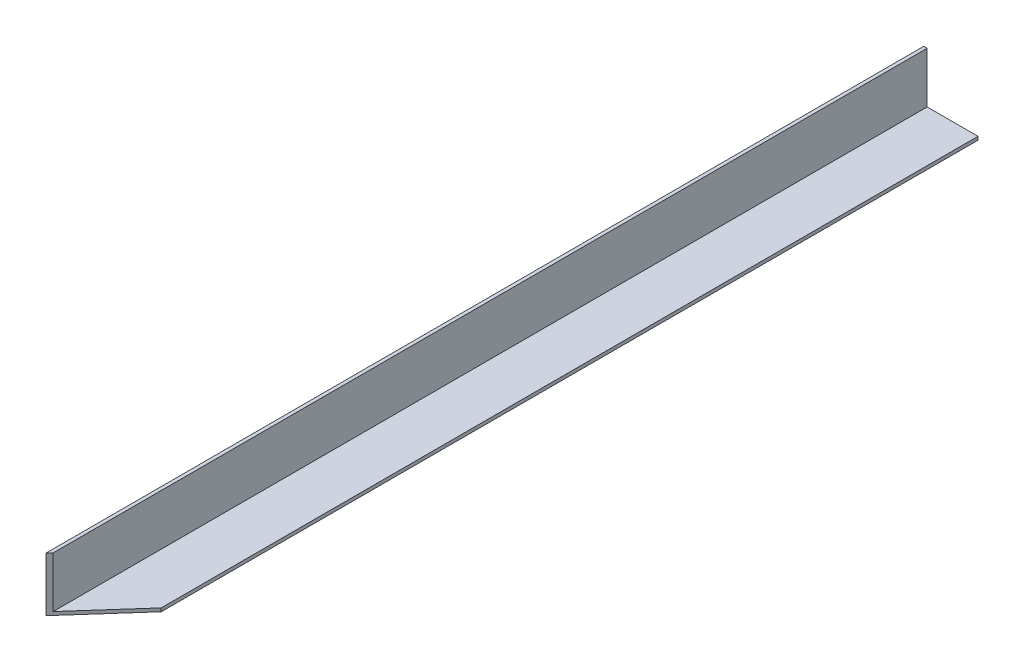
ISO-10303-21;
HEADER;
FILE_DESCRIPTION(('STEP AP214'),'2;1');
FILE_NAME('part.step','',(''),(''),'','','');
FILE_SCHEMA(('AUTOMOTIVE_DESIGN { 1 0 10303 214 1 1 1 1 }'));
ENDSEC;
DATA;
#1=APPLICATION_CONTEXT('core data for automotive mechanical design processes');
#2=APPLICATION_PROTOCOL_DEFINITION('international standard','automotive_design',2000,#1);
#3=PRODUCT_CONTEXT('',#1,'mechanical');
#4=PRODUCT('Part','Part','',(#3));
#5=PRODUCT_RELATED_PRODUCT_CATEGORY('part','',(#4));
#6=PRODUCT_DEFINITION_FORMATION('','',#4);
#7=PRODUCT_DEFINITION_CONTEXT('part definition',#1,'design');
#8=PRODUCT_DEFINITION('design','',#6,#7);
#9=PRODUCT_DEFINITION_SHAPE('','',#8);
#10=(LENGTH_UNIT() NAMED_UNIT(*) SI_UNIT(.MILLI.,.METRE.));
#11=(NAMED_UNIT(*) PLANE_ANGLE_UNIT() SI_UNIT($,.RADIAN.));
#12=(NAMED_UNIT(*) SI_UNIT($,.STERADIAN.) SOLID_ANGLE_UNIT());
#13=UNCERTAINTY_MEASURE_WITH_UNIT(LENGTH_MEASURE(1.E-05),#10,'distance_accuracy_value','');
#14=(GEOMETRIC_REPRESENTATION_CONTEXT(3) GLOBAL_UNCERTAINTY_ASSIGNED_CONTEXT((#13)) GLOBAL_UNIT_ASSIGNED_CONTEXT((#10,
#11,#12)) REPRESENTATION_CONTEXT('',''));
#15=CARTESIAN_POINT('',(0.,0.,0.));
#16=DIRECTION('',(0.,0.,1.));
#17=DIRECTION('',(1.,0.,0.));
#18=AXIS2_PLACEMENT_3D('',#15,#16,#17);
#19=CARTESIAN_POINT('',(0.,-1.,259.));
#20=DIRECTION('',(0.,1.,0.));
#21=DIRECTION('',(0.,0.,1.));
#22=AXIS2_PLACEMENT_3D('',#19,#20,#21);
#23=PLANE('',#22);
#24=DIRECTION('',(0.,0.,-1.));
#25=VECTOR('',#24,1.);
#26=CARTESIAN_POINT('',(15.,-1.,259.));
#27=LINE('',#26,#25);
#28=CARTESIAN_POINT('',(15.,-1.,241.));
#29=VERTEX_POINT('',#28);
#30=CARTESIAN_POINT('',(15.,-1.,0.));
#31=VERTEX_POINT('',#30);
#32=EDGE_CURVE('E11',#29,#31,#27,.T.);
#33=ORIENTED_EDGE('',*,*,#32,.F.);
#34=DIRECTION('',(0.664363838829919,0.,-0.74740931868366));
#35=VECTOR('',#34,1.);
#36=CARTESIAN_POINT('',(-1.,-1.,259.));
#37=LINE('',#36,#35);
#38=CARTESIAN_POINT('',(-1.,-1.,259.));
#39=VERTEX_POINT('',#38);
#40=EDGE_CURVE('E128',#39,#29,#37,.T.);
#41=ORIENTED_EDGE('',*,*,#40,.F.);
#42=DIRECTION('',(0.,0.,-1.));
#43=VECTOR('',#42,1.);
#44=CARTESIAN_POINT('',(-1.,-1.,259.));
#45=LINE('',#44,#43);
#46=CARTESIAN_POINT('',(-1.,-1.,0.));
#47=VERTEX_POINT('',#46);
#48=EDGE_CURVE('E79',#39,#47,#45,.T.);
#49=ORIENTED_EDGE('',*,*,#48,.T.);
#50=DIRECTION('',(1.,0.,0.));
#51=VECTOR('',#50,1.);
#52=CARTESIAN_POINT('',(0.,-1.,0.));
#53=LINE('',#52,#51);
#54=EDGE_CURVE('E89',#47,#31,#53,.T.);
#55=ORIENTED_EDGE('',*,*,#54,.T.);
#56=EDGE_LOOP('',(#33,#41,#49,#55));
#57=FACE_BOUND('',#56,.T.);
#58=ADVANCED_FACE('F33',(#57),#23,.F.);
#59=CARTESIAN_POINT('',(15.,0.,259.));
#60=DIRECTION('',(1.,0.,0.));
#61=DIRECTION('',(0.,0.,-1.));
#62=AXIS2_PLACEMENT_3D('',#59,#60,#61);
#63=PLANE('',#62);
#64=DIRECTION('',(0.,-1.,0.));
#65=VECTOR('',#64,1.);
#66=CARTESIAN_POINT('',(15.,15.,241.));
#67=LINE('',#66,#65);
#68=CARTESIAN_POINT('',(15.,0.,241.));
#69=VERTEX_POINT('',#68);
#70=EDGE_CURVE('E126',#69,#29,#67,.T.);
#71=ORIENTED_EDGE('',*,*,#70,.T.);
#72=ORIENTED_EDGE('',*,*,#32,.T.);
#73=DIRECTION('',(0.,-1.,0.));
#74=VECTOR('',#73,1.);
#75=CARTESIAN_POINT('',(15.,0.,0.));
#76=LINE('',#75,#74);
#77=CARTESIAN_POINT('',(15.,0.,0.));
#78=VERTEX_POINT('',#77);
#79=EDGE_CURVE('E116',#78,#31,#76,.T.);
#80=ORIENTED_EDGE('',*,*,#79,.F.);
#81=DIRECTION('',(0.,0.,-1.));
#82=VECTOR('',#81,1.);
#83=CARTESIAN_POINT('',(15.,0.,259.));
#84=LINE('',#83,#82);
#85=EDGE_CURVE('E41',#69,#78,#84,.T.);
#86=ORIENTED_EDGE('',*,*,#85,.F.);
#87=EDGE_LOOP('',(#71,#72,#80,#86));
#88=FACE_BOUND('',#87,.T.);
#89=ADVANCED_FACE('F117',(#88),#63,.T.);
#90=CARTESIAN_POINT('',(0.,0.,259.));
#91=DIRECTION('',(0.,1.,0.));
#92=DIRECTION('',(0.,0.,1.));
#93=AXIS2_PLACEMENT_3D('',#90,#91,#92);
#94=PLANE('',#93);
#95=DIRECTION('',(-0.664363838829919,0.,0.74740931868366));
#96=VECTOR('',#95,1.);
#97=CARTESIAN_POINT('',(-0.558620689655173,0.,258.503448275862));
#98=LINE('',#97,#96);
#99=CARTESIAN_POINT('',(0.,0.,257.875));
#100=VERTEX_POINT('',#99);
#101=EDGE_CURVE('E113',#69,#100,#98,.T.);
#102=ORIENTED_EDGE('',*,*,#101,.F.);
#103=ORIENTED_EDGE('',*,*,#85,.T.);
#104=DIRECTION('',(1.,0.,0.));
#105=VECTOR('',#104,1.);
#106=CARTESIAN_POINT('',(0.,0.,0.));
#107=LINE('',#106,#105);
#108=CARTESIAN_POINT('',(0.,0.,0.));
#109=VERTEX_POINT('',#108);
#110=EDGE_CURVE('E96',#109,#78,#107,.T.);
#111=ORIENTED_EDGE('',*,*,#110,.F.);
#112=DIRECTION('',(0.,0.,-1.));
#113=VECTOR('',#112,1.);
#114=CARTESIAN_POINT('',(0.,0.,259.));
#115=LINE('',#114,#113);
#116=EDGE_CURVE('E102',#100,#109,#115,.T.);
#117=ORIENTED_EDGE('',*,*,#116,.F.);
#118=EDGE_LOOP('',(#102,#103,#111,#117));
#119=FACE_BOUND('',#118,.T.);
#120=ADVANCED_FACE('F108',(#119),#94,.T.);
#121=CARTESIAN_POINT('',(0.,0.,259.));
#122=DIRECTION('',(1.,0.,0.));
#123=DIRECTION('',(0.,0.,-1.));
#124=AXIS2_PLACEMENT_3D('',#121,#122,#123);
#125=PLANE('',#124);
#126=DIRECTION('',(0.,1.,0.));
#127=VECTOR('',#126,1.);
#128=CARTESIAN_POINT('',(0.,0.,257.875));
#129=LINE('',#128,#127);
#130=CARTESIAN_POINT('',(0.,15.,257.875));
#131=VERTEX_POINT('',#130);
#132=EDGE_CURVE('E124',#100,#131,#129,.T.);
#133=ORIENTED_EDGE('',*,*,#132,.F.);
#134=ORIENTED_EDGE('',*,*,#116,.T.);
#135=DIRECTION('',(0.,-1.,0.));
#136=VECTOR('',#135,1.);
#137=CARTESIAN_POINT('',(0.,0.,0.));
#138=LINE('',#137,#136);
#139=CARTESIAN_POINT('',(0.,15.,0.));
#140=VERTEX_POINT('',#139);
#141=EDGE_CURVE('E94',#140,#109,#138,.T.);
#142=ORIENTED_EDGE('',*,*,#141,.F.);
#143=DIRECTION('',(0.,0.,-1.));
#144=VECTOR('',#143,1.);
#145=CARTESIAN_POINT('',(0.,15.,259.));
#146=LINE('',#145,#144);
#147=EDGE_CURVE('E78',#131,#140,#146,.T.);
#148=ORIENTED_EDGE('',*,*,#147,.F.);
#149=EDGE_LOOP('',(#133,#134,#142,#148));
#150=FACE_BOUND('',#149,.T.);
#151=ADVANCED_FACE('F136',(#150),#125,.T.);
#152=CARTESIAN_POINT('',(-1.,15.,259.));
#153=DIRECTION('',(0.,1.,0.));
#154=DIRECTION('',(0.,0.,1.));
#155=AXIS2_PLACEMENT_3D('',#152,#153,#154);
#156=PLANE('',#155);
#157=DIRECTION('',(0.664363838829919,0.,-0.74740931868366));
#158=VECTOR('',#157,1.);
#159=CARTESIAN_POINT('',(-1.,15.,259.));
#160=LINE('',#159,#158);
#161=CARTESIAN_POINT('',(-1.,15.,259.));
#162=VERTEX_POINT('',#161);
#163=EDGE_CURVE('E48',#162,#131,#160,.T.);
#164=ORIENTED_EDGE('',*,*,#163,.T.);
#165=ORIENTED_EDGE('',*,*,#147,.T.);
#166=DIRECTION('',(1.,0.,0.));
#167=VECTOR('',#166,1.);
#168=CARTESIAN_POINT('',(-1.,15.,0.));
#169=LINE('',#168,#167);
#170=CARTESIAN_POINT('',(-1.,15.,0.));
#171=VERTEX_POINT('',#170);
#172=EDGE_CURVE('E86',#171,#140,#169,.T.);
#173=ORIENTED_EDGE('',*,*,#172,.F.);
#174=DIRECTION('',(0.,0.,-1.));
#175=VECTOR('',#174,1.);
#176=CARTESIAN_POINT('',(-1.,15.,259.));
#177=LINE('',#176,#175);
#178=EDGE_CURVE('E69',#162,#171,#177,.T.);
#179=ORIENTED_EDGE('',*,*,#178,.F.);
#180=EDGE_LOOP('',(#164,#165,#173,#179));
#181=FACE_BOUND('',#180,.T.);
#182=ADVANCED_FACE('F91',(#181),#156,.T.);
#183=CARTESIAN_POINT('',(-1.,0.,259.));
#184=DIRECTION('',(1.,0.,0.));
#185=DIRECTION('',(0.,0.,-1.));
#186=AXIS2_PLACEMENT_3D('',#183,#184,#185);
#187=PLANE('',#186);
#188=DIRECTION('',(0.,1.,0.));
#189=VECTOR('',#188,1.);
#190=CARTESIAN_POINT('',(-1.,0.,0.));
#191=LINE('',#190,#189);
#192=EDGE_CURVE('E73',#171,#47,#191,.F.);
#193=ORIENTED_EDGE('',*,*,#192,.T.);
#194=ORIENTED_EDGE('',*,*,#48,.F.);
#195=DIRECTION('',(0.,1.,0.));
#196=VECTOR('',#195,1.);
#197=CARTESIAN_POINT('',(-1.,0.,259.));
#198=LINE('',#197,#196);
#199=EDGE_CURVE('E75',#162,#39,#198,.F.);
#200=ORIENTED_EDGE('',*,*,#199,.F.);
#201=ORIENTED_EDGE('',*,*,#178,.T.);
#202=EDGE_LOOP('',(#193,#194,#200,#201));
#203=FACE_BOUND('',#202,.T.);
#204=ADVANCED_FACE('F71',(#203),#187,.F.);
#205=CARTESIAN_POINT('',(0.,0.,0.));
#206=DIRECTION('',(0.,0.,-1.));
#207=DIRECTION('',(-1.,0.,0.));
#208=AXIS2_PLACEMENT_3D('',#205,#206,#207);
#209=PLANE('',#208);
#210=ORIENTED_EDGE('',*,*,#54,.F.);
#211=ORIENTED_EDGE('',*,*,#192,.F.);
#212=ORIENTED_EDGE('',*,*,#172,.T.);
#213=ORIENTED_EDGE('',*,*,#141,.T.);
#214=ORIENTED_EDGE('',*,*,#110,.T.);
#215=ORIENTED_EDGE('',*,*,#79,.T.);
#216=EDGE_LOOP('',(#210,#211,#212,#213,#214,#215));
#217=FACE_BOUND('',#216,.T.);
#218=ADVANCED_FACE('F84',(#217),#209,.T.);
#219=CARTESIAN_POINT('',(-1.,15.,259.));
#220=DIRECTION('',(-0.74740931868366,0.,-0.664363838829919));
#221=DIRECTION('',(-0.664363838829919,0.,0.74740931868366));
#222=AXIS2_PLACEMENT_3D('',#219,#220,#221);
#223=PLANE('',#222);
#224=ORIENTED_EDGE('',*,*,#101,.T.);
#225=ORIENTED_EDGE('',*,*,#132,.T.);
#226=ORIENTED_EDGE('',*,*,#163,.F.);
#227=ORIENTED_EDGE('',*,*,#199,.T.);
#228=ORIENTED_EDGE('',*,*,#40,.T.);
#229=ORIENTED_EDGE('',*,*,#70,.F.);
#230=EDGE_LOOP('',(#224,#225,#226,#227,#228,#229));
#231=FACE_BOUND('',#230,.T.);
#232=ADVANCED_FACE('F142',(#231),#223,.F.);
#233=CLOSED_SHELL('',(#58,#89,#120,#151,#182,#204,#218,#232));
#234=MANIFOLD_SOLID_BREP('B2',#233);
#235=ADVANCED_BREP_SHAPE_REPRESENTATION('',(#18,#234),#14);
#236=SHAPE_DEFINITION_REPRESENTATION(#9,#235);
ENDSEC;
END-ISO-10303-21;
